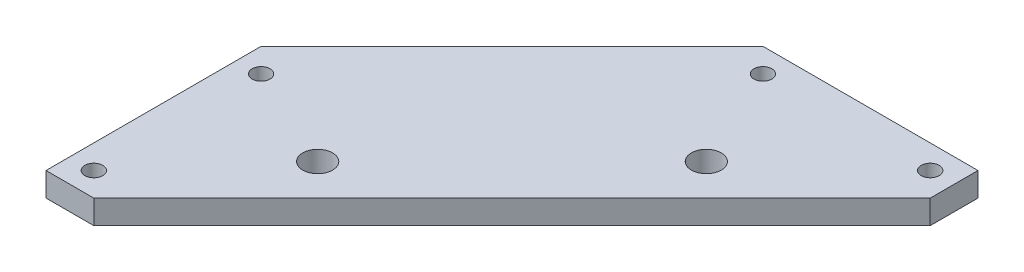
ISO-10303-21;
HEADER;
FILE_DESCRIPTION(('STEP AP214'),'2;1');
FILE_NAME('part.step','',(''),(''),'','','');
FILE_SCHEMA(('AUTOMOTIVE_DESIGN { 1 0 10303 214 1 1 1 1 }'));
ENDSEC;
DATA;
#1=APPLICATION_CONTEXT('core data for automotive mechanical design processes');
#2=APPLICATION_PROTOCOL_DEFINITION('international standard','automotive_design',2000,#1);
#3=PRODUCT_CONTEXT('',#1,'mechanical');
#4=PRODUCT('Part','Part','',(#3));
#5=PRODUCT_RELATED_PRODUCT_CATEGORY('part','',(#4));
#6=PRODUCT_DEFINITION_FORMATION('','',#4);
#7=PRODUCT_DEFINITION_CONTEXT('part definition',#1,'design');
#8=PRODUCT_DEFINITION('design','',#6,#7);
#9=PRODUCT_DEFINITION_SHAPE('','',#8);
#10=(LENGTH_UNIT() NAMED_UNIT(*) SI_UNIT(.MILLI.,.METRE.));
#11=(NAMED_UNIT(*) PLANE_ANGLE_UNIT() SI_UNIT($,.RADIAN.));
#12=(NAMED_UNIT(*) SI_UNIT($,.STERADIAN.) SOLID_ANGLE_UNIT());
#13=UNCERTAINTY_MEASURE_WITH_UNIT(LENGTH_MEASURE(1.E-05),#10,'distance_accuracy_value','');
#14=(GEOMETRIC_REPRESENTATION_CONTEXT(3) GLOBAL_UNCERTAINTY_ASSIGNED_CONTEXT((#13)) GLOBAL_UNIT_ASSIGNED_CONTEXT((#10,
#11,#12)) REPRESENTATION_CONTEXT('',''));
#15=CARTESIAN_POINT('',(0.,0.,0.));
#16=DIRECTION('',(0.,0.,1.));
#17=DIRECTION('',(1.,0.,0.));
#18=AXIS2_PLACEMENT_3D('',#15,#16,#17);
#19=CARTESIAN_POINT('',(0.,4.,0.));
#20=DIRECTION('',(0.,-1.,0.));
#21=DIRECTION('',(0.,0.,-1.));
#22=AXIS2_PLACEMENT_3D('',#19,#20,#21);
#23=PLANE('',#22);
#24=DIRECTION('',(-1.,0.,0.));
#25=VECTOR('',#24,1.);
#26=CARTESIAN_POINT('',(21.,4.,-21.));
#27=LINE('',#26,#25);
#28=CARTESIAN_POINT('',(57.,4.,-21.));
#29=VERTEX_POINT('',#28);
#30=CARTESIAN_POINT('',(21.,4.,-21.));
#31=VERTEX_POINT('',#30);
#32=EDGE_CURVE('E140',#29,#31,#27,.T.);
#33=ORIENTED_EDGE('',*,*,#32,.T.);
#34=DIRECTION('',(-0.707106781186547,0.,0.707106781186548));
#35=VECTOR('',#34,1.);
#36=CARTESIAN_POINT('',(-21.,4.,21.));
#37=LINE('',#36,#35);
#38=CARTESIAN_POINT('',(-21.,4.,21.));
#39=VERTEX_POINT('',#38);
#40=EDGE_CURVE('E92',#31,#39,#37,.T.);
#41=ORIENTED_EDGE('',*,*,#40,.T.);
#42=DIRECTION('',(0.,0.,1.));
#43=VECTOR('',#42,1.);
#44=CARTESIAN_POINT('',(-21.,4.,21.));
#45=LINE('',#44,#43);
#46=CARTESIAN_POINT('',(-20.9999999999999,4.,57.));
#47=VERTEX_POINT('',#46);
#48=EDGE_CURVE('E107',#39,#47,#45,.T.);
#49=ORIENTED_EDGE('',*,*,#48,.T.);
#50=DIRECTION('',(1.,0.,0.));
#51=VECTOR('',#50,1.);
#52=CARTESIAN_POINT('',(-20.9999999999999,4.,57.));
#53=LINE('',#52,#51);
#54=CARTESIAN_POINT('',(-12.9999999999999,4.,57.));
#55=VERTEX_POINT('',#54);
#56=EDGE_CURVE('E105',#47,#55,#53,.T.);
#57=ORIENTED_EDGE('',*,*,#56,.T.);
#58=DIRECTION('',(0.707106781186547,0.,-0.707106781186548));
#59=VECTOR('',#58,1.);
#60=CARTESIAN_POINT('',(57.,4.,-13.));
#61=LINE('',#60,#59);
#62=CARTESIAN_POINT('',(57.,4.,-13.));
#63=VERTEX_POINT('',#62);
#64=EDGE_CURVE('E106',#55,#63,#61,.T.);
#65=ORIENTED_EDGE('',*,*,#64,.T.);
#66=DIRECTION('',(0.,0.,-1.));
#67=VECTOR('',#66,1.);
#68=CARTESIAN_POINT('',(57.,4.,-21.));
#69=LINE('',#68,#67);
#70=EDGE_CURVE('E59',#63,#29,#69,.T.);
#71=ORIENTED_EDGE('',*,*,#70,.T.);
#72=EDGE_LOOP('',(#33,#41,#49,#57,#65,#71));
#73=FACE_BOUND('',#72,.T.);
#74=CARTESIAN_POINT('',(53.,4.,-17.));
#75=DIRECTION('',(0.,1.,0.));
#76=DIRECTION('',(0.,0.,1.));
#77=AXIS2_PLACEMENT_3D('',#74,#75,#76);
#78=CIRCLE('',#77,1.50000000000001);
#79=CARTESIAN_POINT('',(53.,4.,-15.5));
#80=VERTEX_POINT('',#79);
#81=EDGE_CURVE('E128',#80,#80,#78,.T.);
#82=ORIENTED_EDGE('',*,*,#81,.F.);
#83=EDGE_LOOP('',(#82));
#84=FACE_BOUND('',#83,.T.);
#85=CARTESIAN_POINT('',(25.,4.,-17.));
#86=DIRECTION('',(0.,1.,0.));
#87=DIRECTION('',(0.,0.,-1.));
#88=AXIS2_PLACEMENT_3D('',#85,#86,#87);
#89=CIRCLE('',#88,1.50000000000002);
#90=CARTESIAN_POINT('',(25.,4.,-18.5));
#91=VERTEX_POINT('',#90);
#92=EDGE_CURVE('E222',#91,#91,#89,.T.);
#93=ORIENTED_EDGE('',*,*,#92,.F.);
#94=EDGE_LOOP('',(#93));
#95=FACE_BOUND('',#94,.T.);
#96=CARTESIAN_POINT('',(-17.,4.,53.));
#97=DIRECTION('',(0.,1.,0.));
#98=DIRECTION('',(0.,0.,-1.));
#99=AXIS2_PLACEMENT_3D('',#96,#97,#98);
#100=CIRCLE('',#99,1.50000000000001);
#101=CARTESIAN_POINT('',(-17.,4.,51.5));
#102=VERTEX_POINT('',#101);
#103=EDGE_CURVE('E214',#102,#102,#100,.T.);
#104=ORIENTED_EDGE('',*,*,#103,.F.);
#105=EDGE_LOOP('',(#104));
#106=FACE_BOUND('',#105,.T.);
#107=CARTESIAN_POINT('',(-17.,4.,25.));
#108=DIRECTION('',(0.,1.,0.));
#109=DIRECTION('',(0.,0.,1.));
#110=AXIS2_PLACEMENT_3D('',#107,#108,#109);
#111=CIRCLE('',#110,1.50000000000002);
#112=CARTESIAN_POINT('',(-17.,4.,26.5));
#113=VERTEX_POINT('',#112);
#114=EDGE_CURVE('E207',#113,#113,#111,.T.);
#115=ORIENTED_EDGE('',*,*,#114,.F.);
#116=EDGE_LOOP('',(#115));
#117=FACE_BOUND('',#116,.T.);
#118=CARTESIAN_POINT('',(32.9601551083915,4.,0.43324317381031));
#119=DIRECTION('',(0.,1.,0.));
#120=DIRECTION('',(0.,0.,1.));
#121=AXIS2_PLACEMENT_3D('',#118,#119,#120);
#122=CIRCLE('',#121,2.49999999999999);
#123=CARTESIAN_POINT('',(32.9601551083915,4.,2.9332431738103));
#124=VERTEX_POINT('',#123);
#125=EDGE_CURVE('E201',#124,#124,#122,.T.);
#126=ORIENTED_EDGE('',*,*,#125,.F.);
#127=EDGE_LOOP('',(#126));
#128=FACE_BOUND('',#127,.T.);
#129=CARTESIAN_POINT('',(0.433243173810341,4.,32.9601551083915));
#130=DIRECTION('',(0.,1.,0.));
#131=DIRECTION('',(0.,0.,-1.));
#132=AXIS2_PLACEMENT_3D('',#129,#130,#131);
#133=CIRCLE('',#132,2.5);
#134=CARTESIAN_POINT('',(0.433243173810341,4.,30.4601551083915));
#135=VERTEX_POINT('',#134);
#136=EDGE_CURVE('E194',#135,#135,#133,.T.);
#137=ORIENTED_EDGE('',*,*,#136,.F.);
#138=EDGE_LOOP('',(#137));
#139=FACE_BOUND('',#138,.T.);
#140=ADVANCED_FACE('F41',(#73,#84,#95,#106,#117,#128,#139),#23,.F.);
#141=CARTESIAN_POINT('',(0.,0.,0.));
#142=DIRECTION('',(0.,-1.,0.));
#143=DIRECTION('',(0.,0.,-1.));
#144=AXIS2_PLACEMENT_3D('',#141,#142,#143);
#145=PLANE('',#144);
#146=CARTESIAN_POINT('',(32.9601551083915,0.,0.43324317381031));
#147=DIRECTION('',(0.,1.,0.));
#148=DIRECTION('',(0.,0.,1.));
#149=AXIS2_PLACEMENT_3D('',#146,#147,#148);
#150=CIRCLE('',#149,2.49999999999999);
#151=CARTESIAN_POINT('',(32.9601551083915,0.,2.9332431738103));
#152=VERTEX_POINT('',#151);
#153=EDGE_CURVE('E199',#152,#152,#150,.T.);
#154=ORIENTED_EDGE('',*,*,#153,.T.);
#155=EDGE_LOOP('',(#154));
#156=FACE_BOUND('',#155,.T.);
#157=CARTESIAN_POINT('',(-17.,0.,53.));
#158=DIRECTION('',(0.,1.,0.));
#159=DIRECTION('',(0.,0.,-1.));
#160=AXIS2_PLACEMENT_3D('',#157,#158,#159);
#161=CIRCLE('',#160,1.50000000000001);
#162=CARTESIAN_POINT('',(-17.,0.,51.5));
#163=VERTEX_POINT('',#162);
#164=EDGE_CURVE('E215',#163,#163,#161,.T.);
#165=ORIENTED_EDGE('',*,*,#164,.T.);
#166=EDGE_LOOP('',(#165));
#167=FACE_BOUND('',#166,.T.);
#168=CARTESIAN_POINT('',(53.,0.,-17.));
#169=DIRECTION('',(0.,1.,0.));
#170=DIRECTION('',(0.,0.,1.));
#171=AXIS2_PLACEMENT_3D('',#168,#169,#170);
#172=CIRCLE('',#171,1.50000000000001);
#173=CARTESIAN_POINT('',(53.,0.,-15.5));
#174=VERTEX_POINT('',#173);
#175=EDGE_CURVE('E221',#174,#174,#172,.T.);
#176=ORIENTED_EDGE('',*,*,#175,.T.);
#177=EDGE_LOOP('',(#176));
#178=FACE_BOUND('',#177,.T.);
#179=DIRECTION('',(-1.,0.,0.));
#180=VECTOR('',#179,1.);
#181=CARTESIAN_POINT('',(21.,0.,-21.));
#182=LINE('',#181,#180);
#183=CARTESIAN_POINT('',(57.,0.,-21.));
#184=VERTEX_POINT('',#183);
#185=CARTESIAN_POINT('',(21.,0.,-21.));
#186=VERTEX_POINT('',#185);
#187=EDGE_CURVE('E127',#184,#186,#182,.T.);
#188=ORIENTED_EDGE('',*,*,#187,.F.);
#189=DIRECTION('',(0.,0.,-1.));
#190=VECTOR('',#189,1.);
#191=CARTESIAN_POINT('',(57.,0.,-21.));
#192=LINE('',#191,#190);
#193=CARTESIAN_POINT('',(57.,0.,-13.));
#194=VERTEX_POINT('',#193);
#195=EDGE_CURVE('E87',#194,#184,#192,.T.);
#196=ORIENTED_EDGE('',*,*,#195,.F.);
#197=DIRECTION('',(0.707106781186547,0.,-0.707106781186548));
#198=VECTOR('',#197,1.);
#199=CARTESIAN_POINT('',(57.,0.,-13.));
#200=LINE('',#199,#198);
#201=CARTESIAN_POINT('',(-12.9999999999999,0.,57.));
#202=VERTEX_POINT('',#201);
#203=EDGE_CURVE('E83',#202,#194,#200,.T.);
#204=ORIENTED_EDGE('',*,*,#203,.F.);
#205=DIRECTION('',(1.,0.,0.));
#206=VECTOR('',#205,1.);
#207=CARTESIAN_POINT('',(-20.9999999999999,0.,57.));
#208=LINE('',#207,#206);
#209=CARTESIAN_POINT('',(-20.9999999999999,0.,57.));
#210=VERTEX_POINT('',#209);
#211=EDGE_CURVE('E119',#210,#202,#208,.T.);
#212=ORIENTED_EDGE('',*,*,#211,.F.);
#213=DIRECTION('',(0.,0.,1.));
#214=VECTOR('',#213,1.);
#215=CARTESIAN_POINT('',(-21.,0.,21.));
#216=LINE('',#215,#214);
#217=CARTESIAN_POINT('',(-21.,0.,21.));
#218=VERTEX_POINT('',#217);
#219=EDGE_CURVE('E131',#218,#210,#216,.T.);
#220=ORIENTED_EDGE('',*,*,#219,.F.);
#221=DIRECTION('',(-0.707106781186547,0.,0.707106781186548));
#222=VECTOR('',#221,1.);
#223=CARTESIAN_POINT('',(-21.,0.,21.));
#224=LINE('',#223,#222);
#225=EDGE_CURVE('E129',#186,#218,#224,.T.);
#226=ORIENTED_EDGE('',*,*,#225,.F.);
#227=EDGE_LOOP('',(#188,#196,#204,#212,#220,#226));
#228=FACE_BOUND('',#227,.T.);
#229=CARTESIAN_POINT('',(25.,0.,-17.));
#230=DIRECTION('',(0.,1.,0.));
#231=DIRECTION('',(0.,0.,-1.));
#232=AXIS2_PLACEMENT_3D('',#229,#230,#231);
#233=CIRCLE('',#232,1.50000000000002);
#234=CARTESIAN_POINT('',(25.,0.,-18.5));
#235=VERTEX_POINT('',#234);
#236=EDGE_CURVE('E217',#235,#235,#233,.T.);
#237=ORIENTED_EDGE('',*,*,#236,.T.);
#238=EDGE_LOOP('',(#237));
#239=FACE_BOUND('',#238,.T.);
#240=CARTESIAN_POINT('',(-17.,0.,25.));
#241=DIRECTION('',(0.,1.,0.));
#242=DIRECTION('',(0.,0.,1.));
#243=AXIS2_PLACEMENT_3D('',#240,#241,#242);
#244=CIRCLE('',#243,1.50000000000002);
#245=CARTESIAN_POINT('',(-17.,0.,26.5));
#246=VERTEX_POINT('',#245);
#247=EDGE_CURVE('E206',#246,#246,#244,.T.);
#248=ORIENTED_EDGE('',*,*,#247,.T.);
#249=EDGE_LOOP('',(#248));
#250=FACE_BOUND('',#249,.T.);
#251=CARTESIAN_POINT('',(0.433243173810341,0.,32.9601551083915));
#252=DIRECTION('',(0.,1.,0.));
#253=DIRECTION('',(0.,0.,-1.));
#254=AXIS2_PLACEMENT_3D('',#251,#252,#253);
#255=CIRCLE('',#254,2.5);
#256=CARTESIAN_POINT('',(0.433243173810341,0.,30.4601551083915));
#257=VERTEX_POINT('',#256);
#258=EDGE_CURVE('E197',#257,#257,#255,.T.);
#259=ORIENTED_EDGE('',*,*,#258,.T.);
#260=EDGE_LOOP('',(#259));
#261=FACE_BOUND('',#260,.T.);
#262=ADVANCED_FACE('F148',(#156,#167,#178,#228,#239,#250,#261),#145,.T.);
#263=CARTESIAN_POINT('',(21.,4.,-21.));
#264=DIRECTION('',(0.,0.,1.));
#265=DIRECTION('',(1.,0.,0.));
#266=AXIS2_PLACEMENT_3D('',#263,#264,#265);
#267=PLANE('',#266);
#268=ORIENTED_EDGE('',*,*,#187,.T.);
#269=DIRECTION('',(0.,-1.,0.));
#270=VECTOR('',#269,1.);
#271=CARTESIAN_POINT('',(21.,4.,-21.));
#272=LINE('',#271,#270);
#273=EDGE_CURVE('E11',#31,#186,#272,.T.);
#274=ORIENTED_EDGE('',*,*,#273,.F.);
#275=ORIENTED_EDGE('',*,*,#32,.F.);
#276=DIRECTION('',(0.,-1.,0.));
#277=VECTOR('',#276,1.);
#278=CARTESIAN_POINT('',(57.,4.,-21.));
#279=LINE('',#278,#277);
#280=EDGE_CURVE('E125',#29,#184,#279,.T.);
#281=ORIENTED_EDGE('',*,*,#280,.T.);
#282=EDGE_LOOP('',(#268,#274,#275,#281));
#283=FACE_BOUND('',#282,.T.);
#284=ADVANCED_FACE('F43',(#283),#267,.F.);
#285=CARTESIAN_POINT('',(-21.,4.,21.));
#286=DIRECTION('',(0.707106781186548,0.,0.707106781186547));
#287=DIRECTION('',(0.707106781186547,0.,-0.707106781186548));
#288=AXIS2_PLACEMENT_3D('',#285,#286,#287);
#289=PLANE('',#288);
#290=ORIENTED_EDGE('',*,*,#225,.T.);
#291=DIRECTION('',(0.,-1.,0.));
#292=VECTOR('',#291,1.);
#293=CARTESIAN_POINT('',(-21.,4.,21.));
#294=LINE('',#293,#292);
#295=EDGE_CURVE('E49',#39,#218,#294,.T.);
#296=ORIENTED_EDGE('',*,*,#295,.F.);
#297=ORIENTED_EDGE('',*,*,#40,.F.);
#298=ORIENTED_EDGE('',*,*,#273,.T.);
#299=EDGE_LOOP('',(#290,#296,#297,#298));
#300=FACE_BOUND('',#299,.T.);
#301=ADVANCED_FACE('F306',(#300),#289,.F.);
#302=CARTESIAN_POINT('',(-21.,4.,21.));
#303=DIRECTION('',(1.,0.,0.));
#304=DIRECTION('',(0.,0.,-1.));
#305=AXIS2_PLACEMENT_3D('',#302,#303,#304);
#306=PLANE('',#305);
#307=ORIENTED_EDGE('',*,*,#219,.T.);
#308=DIRECTION('',(0.,-1.,0.));
#309=VECTOR('',#308,1.);
#310=CARTESIAN_POINT('',(-20.9999999999999,4.,57.));
#311=LINE('',#310,#309);
#312=EDGE_CURVE('E116',#47,#210,#311,.T.);
#313=ORIENTED_EDGE('',*,*,#312,.F.);
#314=ORIENTED_EDGE('',*,*,#48,.F.);
#315=ORIENTED_EDGE('',*,*,#295,.T.);
#316=EDGE_LOOP('',(#307,#313,#314,#315));
#317=FACE_BOUND('',#316,.T.);
#318=ADVANCED_FACE('F141',(#317),#306,.F.);
#319=CARTESIAN_POINT('',(-20.9999999999999,4.,57.));
#320=DIRECTION('',(0.,0.,-1.));
#321=DIRECTION('',(-1.,0.,0.));
#322=AXIS2_PLACEMENT_3D('',#319,#320,#321);
#323=PLANE('',#322);
#324=ORIENTED_EDGE('',*,*,#211,.T.);
#325=DIRECTION('',(0.,-1.,0.));
#326=VECTOR('',#325,1.);
#327=CARTESIAN_POINT('',(-12.9999999999999,4.,57.));
#328=LINE('',#327,#326);
#329=EDGE_CURVE('E114',#55,#202,#328,.T.);
#330=ORIENTED_EDGE('',*,*,#329,.F.);
#331=ORIENTED_EDGE('',*,*,#56,.F.);
#332=ORIENTED_EDGE('',*,*,#312,.T.);
#333=EDGE_LOOP('',(#324,#330,#331,#332));
#334=FACE_BOUND('',#333,.T.);
#335=ADVANCED_FACE('F111',(#334),#323,.F.);
#336=CARTESIAN_POINT('',(57.,4.,-13.));
#337=DIRECTION('',(-0.707106781186548,0.,-0.707106781186547));
#338=DIRECTION('',(-0.707106781186547,0.,0.707106781186548));
#339=AXIS2_PLACEMENT_3D('',#336,#337,#338);
#340=PLANE('',#339);
#341=ORIENTED_EDGE('',*,*,#203,.T.);
#342=DIRECTION('',(0.,-1.,0.));
#343=VECTOR('',#342,1.);
#344=CARTESIAN_POINT('',(57.,4.,-13.));
#345=LINE('',#344,#343);
#346=EDGE_CURVE('E120',#63,#194,#345,.T.);
#347=ORIENTED_EDGE('',*,*,#346,.F.);
#348=ORIENTED_EDGE('',*,*,#64,.F.);
#349=ORIENTED_EDGE('',*,*,#329,.T.);
#350=EDGE_LOOP('',(#341,#347,#348,#349));
#351=FACE_BOUND('',#350,.T.);
#352=ADVANCED_FACE('F117',(#351),#340,.F.);
#353=CARTESIAN_POINT('',(57.,4.,-21.));
#354=DIRECTION('',(-1.,0.,0.));
#355=DIRECTION('',(0.,0.,1.));
#356=AXIS2_PLACEMENT_3D('',#353,#354,#355);
#357=PLANE('',#356);
#358=ORIENTED_EDGE('',*,*,#195,.T.);
#359=ORIENTED_EDGE('',*,*,#280,.F.);
#360=ORIENTED_EDGE('',*,*,#70,.F.);
#361=ORIENTED_EDGE('',*,*,#346,.T.);
#362=EDGE_LOOP('',(#358,#359,#360,#361));
#363=FACE_BOUND('',#362,.T.);
#364=ADVANCED_FACE('F151',(#363),#357,.F.);
#365=CARTESIAN_POINT('',(53.,4.,-17.));
#366=DIRECTION('',(0.,-1.,0.));
#367=DIRECTION('',(0.,0.,-1.));
#368=AXIS2_PLACEMENT_3D('',#365,#366,#367);
#369=CYLINDRICAL_SURFACE('',#368,1.50000000000001);
#370=ORIENTED_EDGE('',*,*,#81,.T.);
#371=EDGE_LOOP('',(#370));
#372=FACE_BOUND('',#371,.T.);
#373=ORIENTED_EDGE('',*,*,#175,.F.);
#374=EDGE_LOOP('',(#373));
#375=FACE_BOUND('',#374,.T.);
#376=ADVANCED_FACE('F153',(#372,#375),#369,.F.);
#377=CARTESIAN_POINT('',(25.,4.,-17.));
#378=DIRECTION('',(0.,-1.,0.));
#379=DIRECTION('',(0.,0.,-1.));
#380=AXIS2_PLACEMENT_3D('',#377,#378,#379);
#381=CYLINDRICAL_SURFACE('',#380,1.50000000000002);
#382=ORIENTED_EDGE('',*,*,#92,.T.);
#383=EDGE_LOOP('',(#382));
#384=FACE_BOUND('',#383,.T.);
#385=ORIENTED_EDGE('',*,*,#236,.F.);
#386=EDGE_LOOP('',(#385));
#387=FACE_BOUND('',#386,.T.);
#388=ADVANCED_FACE('F157',(#384,#387),#381,.F.);
#389=CARTESIAN_POINT('',(-17.,4.,53.));
#390=DIRECTION('',(0.,-1.,0.));
#391=DIRECTION('',(0.,0.,-1.));
#392=AXIS2_PLACEMENT_3D('',#389,#390,#391);
#393=CYLINDRICAL_SURFACE('',#392,1.50000000000001);
#394=ORIENTED_EDGE('',*,*,#103,.T.);
#395=EDGE_LOOP('',(#394));
#396=FACE_BOUND('',#395,.T.);
#397=ORIENTED_EDGE('',*,*,#164,.F.);
#398=EDGE_LOOP('',(#397));
#399=FACE_BOUND('',#398,.T.);
#400=ADVANCED_FACE('F175',(#396,#399),#393,.F.);
#401=CARTESIAN_POINT('',(-17.,4.,25.));
#402=DIRECTION('',(0.,-1.,0.));
#403=DIRECTION('',(0.,0.,-1.));
#404=AXIS2_PLACEMENT_3D('',#401,#402,#403);
#405=CYLINDRICAL_SURFACE('',#404,1.50000000000002);
#406=ORIENTED_EDGE('',*,*,#114,.T.);
#407=EDGE_LOOP('',(#406));
#408=FACE_BOUND('',#407,.T.);
#409=ORIENTED_EDGE('',*,*,#247,.F.);
#410=EDGE_LOOP('',(#409));
#411=FACE_BOUND('',#410,.T.);
#412=ADVANCED_FACE('F180',(#408,#411),#405,.F.);
#413=CARTESIAN_POINT('',(32.9601551083915,4.,0.43324317381031));
#414=DIRECTION('',(0.,-1.,0.));
#415=DIRECTION('',(0.,0.,-1.));
#416=AXIS2_PLACEMENT_3D('',#413,#414,#415);
#417=CYLINDRICAL_SURFACE('',#416,2.49999999999999);
#418=ORIENTED_EDGE('',*,*,#125,.T.);
#419=EDGE_LOOP('',(#418));
#420=FACE_BOUND('',#419,.T.);
#421=ORIENTED_EDGE('',*,*,#153,.F.);
#422=EDGE_LOOP('',(#421));
#423=FACE_BOUND('',#422,.T.);
#424=ADVANCED_FACE('F182',(#420,#423),#417,.F.);
#425=CARTESIAN_POINT('',(0.433243173810341,4.,32.9601551083915));
#426=DIRECTION('',(0.,-1.,0.));
#427=DIRECTION('',(0.,0.,-1.));
#428=AXIS2_PLACEMENT_3D('',#425,#426,#427);
#429=CYLINDRICAL_SURFACE('',#428,2.5);
#430=ORIENTED_EDGE('',*,*,#136,.T.);
#431=EDGE_LOOP('',(#430));
#432=FACE_BOUND('',#431,.T.);
#433=ORIENTED_EDGE('',*,*,#258,.F.);
#434=EDGE_LOOP('',(#433));
#435=FACE_BOUND('',#434,.T.);
#436=ADVANCED_FACE('F183',(#432,#435),#429,.F.);
#437=CLOSED_SHELL('',(#140,#262,#284,#301,#318,#335,#352,#364,#376,#388,#400,#412,#424,#436));
#438=MANIFOLD_SOLID_BREP('B2',#437);
#439=ADVANCED_BREP_SHAPE_REPRESENTATION('',(#18,#438),#14);
#440=SHAPE_DEFINITION_REPRESENTATION(#9,#439);
ENDSEC;
END-ISO-10303-21;
